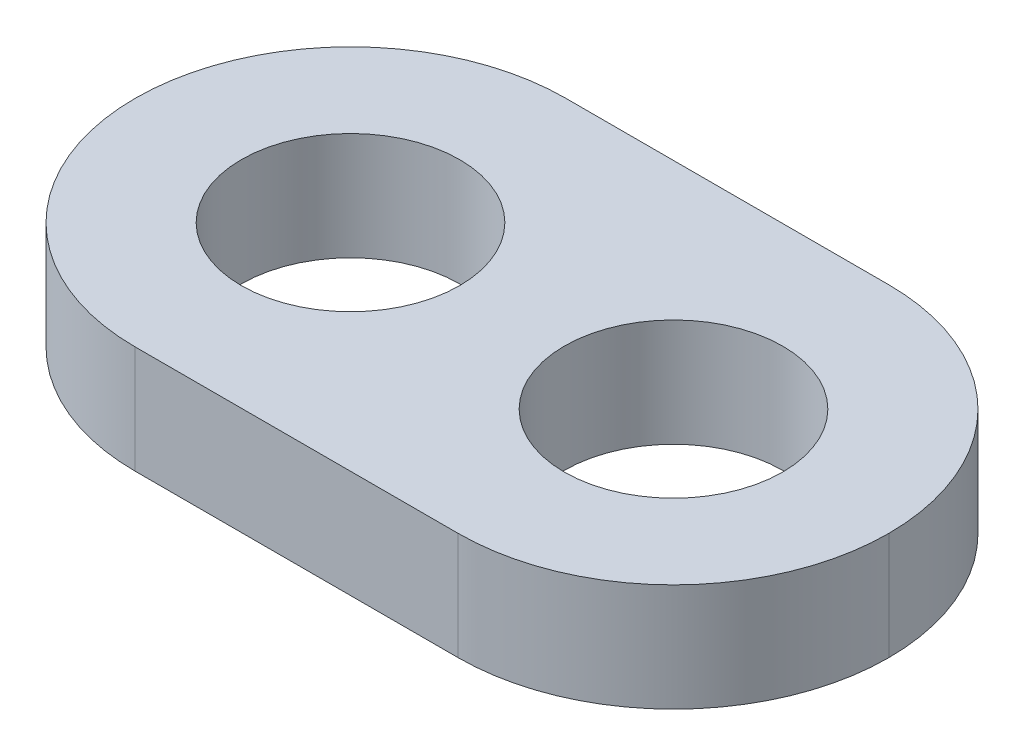
ISO-10303-21;
HEADER;
FILE_DESCRIPTION(('STEP AP214'),'2;1');
FILE_NAME('part.step','',(''),(''),'','','');
FILE_SCHEMA(('AUTOMOTIVE_DESIGN { 1 0 10303 214 1 1 1 1 }'));
ENDSEC;
DATA;
#1=APPLICATION_CONTEXT('core data for automotive mechanical design processes');
#2=APPLICATION_PROTOCOL_DEFINITION('international standard','automotive_design',2000,#1);
#3=PRODUCT_CONTEXT('',#1,'mechanical');
#4=PRODUCT('Part','Part','',(#3));
#5=PRODUCT_RELATED_PRODUCT_CATEGORY('part','',(#4));
#6=PRODUCT_DEFINITION_FORMATION('','',#4);
#7=PRODUCT_DEFINITION_CONTEXT('part definition',#1,'design');
#8=PRODUCT_DEFINITION('design','',#6,#7);
#9=PRODUCT_DEFINITION_SHAPE('','',#8);
#10=(LENGTH_UNIT() NAMED_UNIT(*) SI_UNIT(.MILLI.,.METRE.));
#11=(NAMED_UNIT(*) PLANE_ANGLE_UNIT() SI_UNIT($,.RADIAN.));
#12=(NAMED_UNIT(*) SI_UNIT($,.STERADIAN.) SOLID_ANGLE_UNIT());
#13=UNCERTAINTY_MEASURE_WITH_UNIT(LENGTH_MEASURE(1.E-05),#10,'distance_accuracy_value','');
#14=(GEOMETRIC_REPRESENTATION_CONTEXT(3) GLOBAL_UNCERTAINTY_ASSIGNED_CONTEXT((#13)) GLOBAL_UNIT_ASSIGNED_CONTEXT((#10,
#11,#12)) REPRESENTATION_CONTEXT('',''));
#15=CARTESIAN_POINT('',(0.,0.,0.));
#16=DIRECTION('',(0.,0.,1.));
#17=DIRECTION('',(1.,0.,0.));
#18=AXIS2_PLACEMENT_3D('',#15,#16,#17);
#19=CARTESIAN_POINT('',(0.,5.,0.));
#20=DIRECTION('',(0.,1.,0.));
#21=DIRECTION('',(0.,0.,1.));
#22=AXIS2_PLACEMENT_3D('',#19,#20,#21);
#23=PLANE('',#22);
#24=CARTESIAN_POINT('',(-7.5,5.,0.));
#25=DIRECTION('',(0.,1.,0.));
#26=DIRECTION('',(0.,0.,1.));
#27=AXIS2_PLACEMENT_3D('',#24,#25,#26);
#28=CIRCLE('',#27,5.07);
#29=CARTESIAN_POINT('',(-7.5,5.,5.07));
#30=VERTEX_POINT('',#29);
#31=EDGE_CURVE('E168',#30,#30,#28,.T.);
#32=ORIENTED_EDGE('',*,*,#31,.F.);
#33=EDGE_LOOP('',(#32));
#34=FACE_BOUND('',#33,.T.);
#35=CARTESIAN_POINT('',(7.5,5.,0.));
#36=DIRECTION('',(0.,1.,0.));
#37=DIRECTION('',(0.,0.,1.));
#38=AXIS2_PLACEMENT_3D('',#35,#36,#37);
#39=CIRCLE('',#38,10.);
#40=CARTESIAN_POINT('',(7.5,5.,10.));
#41=VERTEX_POINT('',#40);
#42=CARTESIAN_POINT('',(17.5,5.,0.));
#43=VERTEX_POINT('',#42);
#44=EDGE_CURVE('E63',#41,#43,#39,.T.);
#45=ORIENTED_EDGE('',*,*,#44,.T.);
#46=CARTESIAN_POINT('',(7.5,5.,0.));
#47=DIRECTION('',(0.,1.,0.));
#48=DIRECTION('',(0.,0.,1.));
#49=AXIS2_PLACEMENT_3D('',#46,#47,#48);
#50=CIRCLE('',#49,10.);
#51=CARTESIAN_POINT('',(7.5,5.,-10.));
#52=VERTEX_POINT('',#51);
#53=EDGE_CURVE('E150',#43,#52,#50,.T.);
#54=ORIENTED_EDGE('',*,*,#53,.T.);
#55=DIRECTION('',(-1.,0.,0.));
#56=VECTOR('',#55,1.);
#57=CARTESIAN_POINT('',(-17.5,5.,-10.));
#58=LINE('',#57,#56);
#59=CARTESIAN_POINT('',(-7.49999999999999,5.,-10.));
#60=VERTEX_POINT('',#59);
#61=EDGE_CURVE('E113',#52,#60,#58,.T.);
#62=ORIENTED_EDGE('',*,*,#61,.T.);
#63=CARTESIAN_POINT('',(-7.49999999999999,5.,0.));
#64=DIRECTION('',(0.,1.,0.));
#65=DIRECTION('',(0.,0.,1.));
#66=AXIS2_PLACEMENT_3D('',#63,#64,#65);
#67=CIRCLE('',#66,10.);
#68=CARTESIAN_POINT('',(-17.5,5.,0.));
#69=VERTEX_POINT('',#68);
#70=EDGE_CURVE('E145',#60,#69,#67,.T.);
#71=ORIENTED_EDGE('',*,*,#70,.T.);
#72=CARTESIAN_POINT('',(-7.49999999999999,5.,0.));
#73=DIRECTION('',(0.,1.,0.));
#74=DIRECTION('',(0.,0.,1.));
#75=AXIS2_PLACEMENT_3D('',#72,#73,#74);
#76=CIRCLE('',#75,10.);
#77=CARTESIAN_POINT('',(-7.49999999999999,5.,10.));
#78=VERTEX_POINT('',#77);
#79=EDGE_CURVE('E119',#69,#78,#76,.T.);
#80=ORIENTED_EDGE('',*,*,#79,.T.);
#81=DIRECTION('',(1.,0.,0.));
#82=VECTOR('',#81,1.);
#83=CARTESIAN_POINT('',(-17.5,5.,10.));
#84=LINE('',#83,#82);
#85=EDGE_CURVE('E155',#78,#41,#84,.T.);
#86=ORIENTED_EDGE('',*,*,#85,.T.);
#87=EDGE_LOOP('',(#45,#54,#62,#71,#80,#86));
#88=FACE_BOUND('',#87,.T.);
#89=CARTESIAN_POINT('',(7.5,5.,0.));
#90=DIRECTION('',(0.,1.,0.));
#91=DIRECTION('',(0.,0.,-1.));
#92=AXIS2_PLACEMENT_3D('',#89,#90,#91);
#93=CIRCLE('',#92,5.07);
#94=CARTESIAN_POINT('',(7.5,5.,-5.07));
#95=VERTEX_POINT('',#94);
#96=EDGE_CURVE('E175',#95,#95,#93,.T.);
#97=ORIENTED_EDGE('',*,*,#96,.F.);
#98=EDGE_LOOP('',(#97));
#99=FACE_BOUND('',#98,.T.);
#100=ADVANCED_FACE('F45',(#34,#88,#99),#23,.T.);
#101=CARTESIAN_POINT('',(0.,0.,0.));
#102=DIRECTION('',(0.,1.,0.));
#103=DIRECTION('',(0.,0.,1.));
#104=AXIS2_PLACEMENT_3D('',#101,#102,#103);
#105=PLANE('',#104);
#106=DIRECTION('',(-1.,0.,0.));
#107=VECTOR('',#106,1.);
#108=CARTESIAN_POINT('',(-17.5,0.,-10.));
#109=LINE('',#108,#107);
#110=CARTESIAN_POINT('',(7.5,0.,-10.));
#111=VERTEX_POINT('',#110);
#112=CARTESIAN_POINT('',(-7.49999999999999,0.,-10.));
#113=VERTEX_POINT('',#112);
#114=EDGE_CURVE('E157',#111,#113,#109,.T.);
#115=ORIENTED_EDGE('',*,*,#114,.F.);
#116=CARTESIAN_POINT('',(7.5,0.,0.));
#117=DIRECTION('',(0.,1.,0.));
#118=DIRECTION('',(0.,0.,1.));
#119=AXIS2_PLACEMENT_3D('',#116,#117,#118);
#120=CIRCLE('',#119,10.);
#121=CARTESIAN_POINT('',(17.5,0.,0.));
#122=VERTEX_POINT('',#121);
#123=EDGE_CURVE('E131',#111,#122,#120,.F.);
#124=ORIENTED_EDGE('',*,*,#123,.T.);
#125=CARTESIAN_POINT('',(7.5,0.,0.));
#126=DIRECTION('',(0.,1.,0.));
#127=DIRECTION('',(0.,0.,1.));
#128=AXIS2_PLACEMENT_3D('',#125,#126,#127);
#129=CIRCLE('',#128,10.);
#130=CARTESIAN_POINT('',(7.5,0.,10.));
#131=VERTEX_POINT('',#130);
#132=EDGE_CURVE('E128',#122,#131,#129,.F.);
#133=ORIENTED_EDGE('',*,*,#132,.T.);
#134=DIRECTION('',(1.,0.,0.));
#135=VECTOR('',#134,1.);
#136=CARTESIAN_POINT('',(-17.5,0.,10.));
#137=LINE('',#136,#135);
#138=CARTESIAN_POINT('',(-7.49999999999999,0.,10.));
#139=VERTEX_POINT('',#138);
#140=EDGE_CURVE('E109',#139,#131,#137,.T.);
#141=ORIENTED_EDGE('',*,*,#140,.F.);
#142=CARTESIAN_POINT('',(-7.49999999999999,0.,0.));
#143=DIRECTION('',(0.,1.,0.));
#144=DIRECTION('',(0.,0.,1.));
#145=AXIS2_PLACEMENT_3D('',#142,#143,#144);
#146=CIRCLE('',#145,10.);
#147=CARTESIAN_POINT('',(-17.5,0.,0.));
#148=VERTEX_POINT('',#147);
#149=EDGE_CURVE('E101',#139,#148,#146,.F.);
#150=ORIENTED_EDGE('',*,*,#149,.T.);
#151=CARTESIAN_POINT('',(-7.49999999999999,0.,0.));
#152=DIRECTION('',(0.,1.,0.));
#153=DIRECTION('',(0.,0.,1.));
#154=AXIS2_PLACEMENT_3D('',#151,#152,#153);
#155=CIRCLE('',#154,10.);
#156=EDGE_CURVE('E107',#148,#113,#155,.F.);
#157=ORIENTED_EDGE('',*,*,#156,.T.);
#158=EDGE_LOOP('',(#115,#124,#133,#141,#150,#157));
#159=FACE_BOUND('',#158,.T.);
#160=CARTESIAN_POINT('',(-7.5,0.,0.));
#161=DIRECTION('',(0.,1.,0.));
#162=DIRECTION('',(0.,0.,1.));
#163=AXIS2_PLACEMENT_3D('',#160,#161,#162);
#164=CIRCLE('',#163,5.07);
#165=CARTESIAN_POINT('',(-7.5,0.,5.07));
#166=VERTEX_POINT('',#165);
#167=EDGE_CURVE('E164',#166,#166,#164,.T.);
#168=ORIENTED_EDGE('',*,*,#167,.T.);
#169=EDGE_LOOP('',(#168));
#170=FACE_BOUND('',#169,.T.);
#171=CARTESIAN_POINT('',(7.5,0.,0.));
#172=DIRECTION('',(0.,1.,0.));
#173=DIRECTION('',(0.,0.,-1.));
#174=AXIS2_PLACEMENT_3D('',#171,#172,#173);
#175=CIRCLE('',#174,5.07);
#176=CARTESIAN_POINT('',(7.5,0.,-5.07));
#177=VERTEX_POINT('',#176);
#178=EDGE_CURVE('E122',#177,#177,#175,.T.);
#179=ORIENTED_EDGE('',*,*,#178,.T.);
#180=EDGE_LOOP('',(#179));
#181=FACE_BOUND('',#180,.T.);
#182=ADVANCED_FACE('F104',(#159,#170,#181),#105,.F.);
#183=CARTESIAN_POINT('',(-17.5,5.,10.));
#184=DIRECTION('',(0.,0.,-1.));
#185=DIRECTION('',(-1.,0.,0.));
#186=AXIS2_PLACEMENT_3D('',#183,#184,#185);
#187=PLANE('',#186);
#188=ORIENTED_EDGE('',*,*,#140,.T.);
#189=DIRECTION('',(0.,-1.,0.));
#190=VECTOR('',#189,1.);
#191=CARTESIAN_POINT('',(7.5,5.,10.));
#192=LINE('',#191,#190);
#193=EDGE_CURVE('E11',#131,#41,#192,.F.);
#194=ORIENTED_EDGE('',*,*,#193,.T.);
#195=ORIENTED_EDGE('',*,*,#85,.F.);
#196=DIRECTION('',(0.,-1.,0.));
#197=VECTOR('',#196,1.);
#198=CARTESIAN_POINT('',(-7.49999999999999,5.,10.));
#199=LINE('',#198,#197);
#200=EDGE_CURVE('E55',#78,#139,#199,.T.);
#201=ORIENTED_EDGE('',*,*,#200,.T.);
#202=EDGE_LOOP('',(#188,#194,#195,#201));
#203=FACE_BOUND('',#202,.T.);
#204=ADVANCED_FACE('F154',(#203),#187,.F.);
#205=CARTESIAN_POINT('',(-17.5,5.,-10.));
#206=DIRECTION('',(0.,0.,1.));
#207=DIRECTION('',(1.,0.,0.));
#208=AXIS2_PLACEMENT_3D('',#205,#206,#207);
#209=PLANE('',#208);
#210=ORIENTED_EDGE('',*,*,#114,.T.);
#211=DIRECTION('',(0.,-1.,0.));
#212=VECTOR('',#211,1.);
#213=CARTESIAN_POINT('',(-7.49999999999999,5.,-10.));
#214=LINE('',#213,#212);
#215=EDGE_CURVE('E126',#113,#60,#214,.F.);
#216=ORIENTED_EDGE('',*,*,#215,.T.);
#217=ORIENTED_EDGE('',*,*,#61,.F.);
#218=DIRECTION('',(0.,-1.,0.));
#219=VECTOR('',#218,1.);
#220=CARTESIAN_POINT('',(7.5,5.,-10.));
#221=LINE('',#220,#219);
#222=EDGE_CURVE('E137',#52,#111,#221,.T.);
#223=ORIENTED_EDGE('',*,*,#222,.T.);
#224=EDGE_LOOP('',(#210,#216,#217,#223));
#225=FACE_BOUND('',#224,.T.);
#226=ADVANCED_FACE('F199',(#225),#209,.F.);
#227=CARTESIAN_POINT('',(-7.5,5.,0.));
#228=DIRECTION('',(0.,-1.,0.));
#229=DIRECTION('',(0.,0.,-1.));
#230=AXIS2_PLACEMENT_3D('',#227,#228,#229);
#231=CYLINDRICAL_SURFACE('',#230,5.07);
#232=ORIENTED_EDGE('',*,*,#31,.T.);
#233=EDGE_LOOP('',(#232));
#234=FACE_BOUND('',#233,.T.);
#235=ORIENTED_EDGE('',*,*,#167,.F.);
#236=EDGE_LOOP('',(#235));
#237=FACE_BOUND('',#236,.T.);
#238=ADVANCED_FACE('F196',(#234,#237),#231,.F.);
#239=CARTESIAN_POINT('',(7.5,5.,0.));
#240=DIRECTION('',(0.,-1.,0.));
#241=DIRECTION('',(0.,0.,-1.));
#242=AXIS2_PLACEMENT_3D('',#239,#240,#241);
#243=CYLINDRICAL_SURFACE('',#242,5.07);
#244=ORIENTED_EDGE('',*,*,#96,.T.);
#245=EDGE_LOOP('',(#244));
#246=FACE_BOUND('',#245,.T.);
#247=ORIENTED_EDGE('',*,*,#178,.F.);
#248=EDGE_LOOP('',(#247));
#249=FACE_BOUND('',#248,.T.);
#250=ADVANCED_FACE('F184',(#246,#249),#243,.F.);
#251=CARTESIAN_POINT('',(-7.49999999999999,5.,0.));
#252=DIRECTION('',(0.,-1.,0.));
#253=DIRECTION('',(0.,0.,-1.));
#254=AXIS2_PLACEMENT_3D('',#251,#252,#253);
#255=CYLINDRICAL_SURFACE('',#254,10.);
#256=ORIENTED_EDGE('',*,*,#200,.F.);
#257=ORIENTED_EDGE('',*,*,#79,.F.);
#258=DIRECTION('',(0.,-1.,0.));
#259=VECTOR('',#258,1.);
#260=CARTESIAN_POINT('',(-17.5,5.,0.));
#261=LINE('',#260,#259);
#262=EDGE_CURVE('E117',#148,#69,#261,.F.);
#263=ORIENTED_EDGE('',*,*,#262,.F.);
#264=ORIENTED_EDGE('',*,*,#149,.F.);
#265=EDGE_LOOP('',(#256,#257,#263,#264));
#266=FACE_BOUND('',#265,.T.);
#267=ADVANCED_FACE('F118',(#266),#255,.T.);
#268=CARTESIAN_POINT('',(-7.49999999999999,5.,0.));
#269=DIRECTION('',(0.,-1.,0.));
#270=DIRECTION('',(0.,0.,-1.));
#271=AXIS2_PLACEMENT_3D('',#268,#269,#270);
#272=CYLINDRICAL_SURFACE('',#271,10.);
#273=ORIENTED_EDGE('',*,*,#70,.F.);
#274=ORIENTED_EDGE('',*,*,#215,.F.);
#275=ORIENTED_EDGE('',*,*,#156,.F.);
#276=ORIENTED_EDGE('',*,*,#262,.T.);
#277=EDGE_LOOP('',(#273,#274,#275,#276));
#278=FACE_BOUND('',#277,.T.);
#279=ADVANCED_FACE('F124',(#278),#272,.T.);
#280=CARTESIAN_POINT('',(7.5,5.,0.));
#281=DIRECTION('',(0.,-1.,0.));
#282=DIRECTION('',(0.,0.,-1.));
#283=AXIS2_PLACEMENT_3D('',#280,#281,#282);
#284=CYLINDRICAL_SURFACE('',#283,10.);
#285=DIRECTION('',(0.,-1.,0.));
#286=VECTOR('',#285,1.);
#287=CARTESIAN_POINT('',(17.5,5.,0.));
#288=LINE('',#287,#286);
#289=EDGE_CURVE('E49',#43,#122,#288,.T.);
#290=ORIENTED_EDGE('',*,*,#289,.F.);
#291=ORIENTED_EDGE('',*,*,#44,.F.);
#292=ORIENTED_EDGE('',*,*,#193,.F.);
#293=ORIENTED_EDGE('',*,*,#132,.F.);
#294=EDGE_LOOP('',(#290,#291,#292,#293));
#295=FACE_BOUND('',#294,.T.);
#296=ADVANCED_FACE('F47',(#295),#284,.T.);
#297=CARTESIAN_POINT('',(7.5,5.,0.));
#298=DIRECTION('',(0.,-1.,0.));
#299=DIRECTION('',(0.,0.,-1.));
#300=AXIS2_PLACEMENT_3D('',#297,#298,#299);
#301=CYLINDRICAL_SURFACE('',#300,10.);
#302=ORIENTED_EDGE('',*,*,#53,.F.);
#303=ORIENTED_EDGE('',*,*,#289,.T.);
#304=ORIENTED_EDGE('',*,*,#123,.F.);
#305=ORIENTED_EDGE('',*,*,#222,.F.);
#306=EDGE_LOOP('',(#302,#303,#304,#305));
#307=FACE_BOUND('',#306,.T.);
#308=ADVANCED_FACE('F208',(#307),#301,.T.);
#309=CLOSED_SHELL('',(#100,#182,#204,#226,#238,#250,#267,#279,#296,#308));
#310=MANIFOLD_SOLID_BREP('B2',#309);
#311=ADVANCED_BREP_SHAPE_REPRESENTATION('',(#18,#310),#14);
#312=SHAPE_DEFINITION_REPRESENTATION(#9,#311);
ENDSEC;
END-ISO-10303-21;
